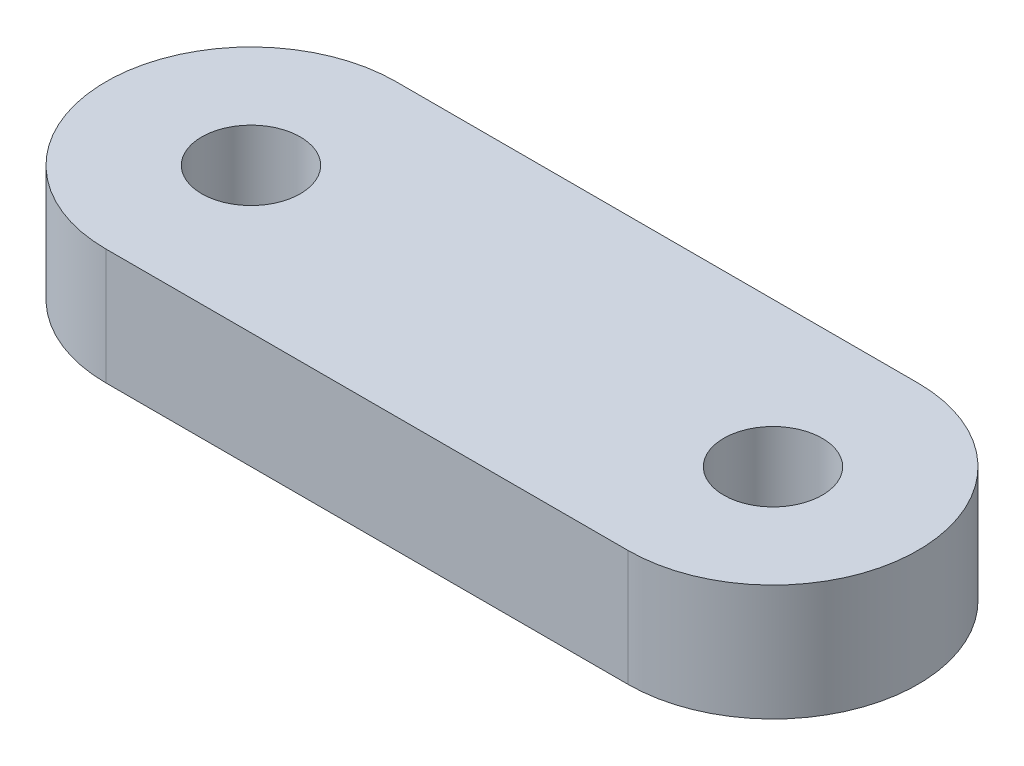
ISO-10303-21;
HEADER;
FILE_DESCRIPTION(('STEP AP214'),'2;1');
FILE_NAME('part.step','',(''),(''),'','','');
FILE_SCHEMA(('AUTOMOTIVE_DESIGN { 1 0 10303 214 1 1 1 1 }'));
ENDSEC;
DATA;
#1=APPLICATION_CONTEXT('core data for automotive mechanical design processes');
#2=APPLICATION_PROTOCOL_DEFINITION('international standard','automotive_design',2000,#1);
#3=PRODUCT_CONTEXT('',#1,'mechanical');
#4=PRODUCT('Part','Part','',(#3));
#5=PRODUCT_RELATED_PRODUCT_CATEGORY('part','',(#4));
#6=PRODUCT_DEFINITION_FORMATION('','',#4);
#7=PRODUCT_DEFINITION_CONTEXT('part definition',#1,'design');
#8=PRODUCT_DEFINITION('design','',#6,#7);
#9=PRODUCT_DEFINITION_SHAPE('','',#8);
#10=(LENGTH_UNIT() NAMED_UNIT(*) SI_UNIT(.MILLI.,.METRE.));
#11=(NAMED_UNIT(*) PLANE_ANGLE_UNIT() SI_UNIT($,.RADIAN.));
#12=(NAMED_UNIT(*) SI_UNIT($,.STERADIAN.) SOLID_ANGLE_UNIT());
#13=UNCERTAINTY_MEASURE_WITH_UNIT(LENGTH_MEASURE(1.E-05),#10,'distance_accuracy_value','');
#14=(GEOMETRIC_REPRESENTATION_CONTEXT(3) GLOBAL_UNCERTAINTY_ASSIGNED_CONTEXT((#13)) GLOBAL_UNIT_ASSIGNED_CONTEXT((#10,
#11,#12)) REPRESENTATION_CONTEXT('',''));
#15=CARTESIAN_POINT('',(0.,0.,0.));
#16=DIRECTION('',(0.,0.,1.));
#17=DIRECTION('',(1.,0.,0.));
#18=AXIS2_PLACEMENT_3D('',#15,#16,#17);
#19=CARTESIAN_POINT('',(9.,4.,0.));
#20=DIRECTION('',(0.,1.,0.));
#21=DIRECTION('',(0.,0.,1.));
#22=AXIS2_PLACEMENT_3D('',#19,#20,#21);
#23=PLANE('',#22);
#24=CARTESIAN_POINT('',(-9.,4.,0.));
#25=DIRECTION('',(0.,1.,0.));
#26=DIRECTION('',(0.,0.,1.));
#27=AXIS2_PLACEMENT_3D('',#24,#25,#26);
#28=CIRCLE('',#27,1.7);
#29=CARTESIAN_POINT('',(-9.,4.,1.7));
#30=VERTEX_POINT('',#29);
#31=EDGE_CURVE('E100',#30,#30,#28,.T.);
#32=ORIENTED_EDGE('',*,*,#31,.F.);
#33=EDGE_LOOP('',(#32));
#34=FACE_BOUND('',#33,.T.);
#35=CARTESIAN_POINT('',(9.,4.,0.));
#36=DIRECTION('',(0.,1.,0.));
#37=DIRECTION('',(0.,0.,1.));
#38=AXIS2_PLACEMENT_3D('',#35,#36,#37);
#39=CIRCLE('',#38,5.);
#40=CARTESIAN_POINT('',(9.,4.,5.));
#41=VERTEX_POINT('',#40);
#42=CARTESIAN_POINT('',(9.,4.,-5.));
#43=VERTEX_POINT('',#42);
#44=EDGE_CURVE('E85',#41,#43,#39,.T.);
#45=ORIENTED_EDGE('',*,*,#44,.T.);
#46=DIRECTION('',(-1.,0.,0.));
#47=VECTOR('',#46,1.);
#48=CARTESIAN_POINT('',(-9.,4.,-5.));
#49=LINE('',#48,#47);
#50=CARTESIAN_POINT('',(-9.,4.,-5.));
#51=VERTEX_POINT('',#50);
#52=EDGE_CURVE('E80',#43,#51,#49,.T.);
#53=ORIENTED_EDGE('',*,*,#52,.T.);
#54=CARTESIAN_POINT('',(-9.,4.,0.));
#55=DIRECTION('',(0.,1.,0.));
#56=DIRECTION('',(0.,0.,1.));
#57=AXIS2_PLACEMENT_3D('',#54,#55,#56);
#58=CIRCLE('',#57,5.);
#59=CARTESIAN_POINT('',(-9.,4.,5.));
#60=VERTEX_POINT('',#59);
#61=EDGE_CURVE('E83',#51,#60,#58,.T.);
#62=ORIENTED_EDGE('',*,*,#61,.T.);
#63=DIRECTION('',(1.,0.,0.));
#64=VECTOR('',#63,1.);
#65=CARTESIAN_POINT('',(-9.,4.,5.));
#66=LINE('',#65,#64);
#67=EDGE_CURVE('E50',#60,#41,#66,.T.);
#68=ORIENTED_EDGE('',*,*,#67,.T.);
#69=EDGE_LOOP('',(#45,#53,#62,#68));
#70=FACE_BOUND('',#69,.T.);
#71=CARTESIAN_POINT('',(9.,4.,0.));
#72=DIRECTION('',(0.,1.,0.));
#73=DIRECTION('',(0.,0.,1.));
#74=AXIS2_PLACEMENT_3D('',#71,#72,#73);
#75=CIRCLE('',#74,1.7);
#76=CARTESIAN_POINT('',(9.,4.,1.7));
#77=VERTEX_POINT('',#76);
#78=EDGE_CURVE('E115',#77,#77,#75,.T.);
#79=ORIENTED_EDGE('',*,*,#78,.F.);
#80=EDGE_LOOP('',(#79));
#81=FACE_BOUND('',#80,.T.);
#82=ADVANCED_FACE('F33',(#34,#70,#81),#23,.T.);
#83=CARTESIAN_POINT('',(9.,0.,0.));
#84=DIRECTION('',(0.,1.,0.));
#85=DIRECTION('',(0.,0.,1.));
#86=AXIS2_PLACEMENT_3D('',#83,#84,#85);
#87=PLANE('',#86);
#88=CARTESIAN_POINT('',(-9.,0.,0.));
#89=DIRECTION('',(0.,1.,0.));
#90=DIRECTION('',(0.,0.,1.));
#91=AXIS2_PLACEMENT_3D('',#88,#89,#90);
#92=CIRCLE('',#91,1.7);
#93=CARTESIAN_POINT('',(-9.,0.,1.7));
#94=VERTEX_POINT('',#93);
#95=EDGE_CURVE('E112',#94,#94,#92,.T.);
#96=ORIENTED_EDGE('',*,*,#95,.T.);
#97=EDGE_LOOP('',(#96));
#98=FACE_BOUND('',#97,.T.);
#99=CARTESIAN_POINT('',(9.,0.,0.));
#100=DIRECTION('',(0.,1.,0.));
#101=DIRECTION('',(0.,0.,1.));
#102=AXIS2_PLACEMENT_3D('',#99,#100,#101);
#103=CIRCLE('',#102,5.);
#104=CARTESIAN_POINT('',(9.,0.,5.));
#105=VERTEX_POINT('',#104);
#106=CARTESIAN_POINT('',(9.,0.,-5.));
#107=VERTEX_POINT('',#106);
#108=EDGE_CURVE('E97',#105,#107,#103,.T.);
#109=ORIENTED_EDGE('',*,*,#108,.F.);
#110=DIRECTION('',(1.,0.,0.));
#111=VECTOR('',#110,1.);
#112=CARTESIAN_POINT('',(-9.,0.,5.));
#113=LINE('',#112,#111);
#114=CARTESIAN_POINT('',(-9.,0.,5.));
#115=VERTEX_POINT('',#114);
#116=EDGE_CURVE('E73',#115,#105,#113,.T.);
#117=ORIENTED_EDGE('',*,*,#116,.F.);
#118=CARTESIAN_POINT('',(-9.,0.,0.));
#119=DIRECTION('',(0.,1.,0.));
#120=DIRECTION('',(0.,0.,1.));
#121=AXIS2_PLACEMENT_3D('',#118,#119,#120);
#122=CIRCLE('',#121,5.);
#123=CARTESIAN_POINT('',(-9.,0.,-5.));
#124=VERTEX_POINT('',#123);
#125=EDGE_CURVE('E67',#124,#115,#122,.T.);
#126=ORIENTED_EDGE('',*,*,#125,.F.);
#127=DIRECTION('',(-1.,0.,0.));
#128=VECTOR('',#127,1.);
#129=CARTESIAN_POINT('',(-9.,0.,-5.));
#130=LINE('',#129,#128);
#131=EDGE_CURVE('E89',#107,#124,#130,.T.);
#132=ORIENTED_EDGE('',*,*,#131,.F.);
#133=EDGE_LOOP('',(#109,#117,#126,#132));
#134=FACE_BOUND('',#133,.T.);
#135=CARTESIAN_POINT('',(9.,0.,0.));
#136=DIRECTION('',(0.,1.,0.));
#137=DIRECTION('',(0.,0.,1.));
#138=AXIS2_PLACEMENT_3D('',#135,#136,#137);
#139=CIRCLE('',#138,1.7);
#140=CARTESIAN_POINT('',(9.,0.,1.7));
#141=VERTEX_POINT('',#140);
#142=EDGE_CURVE('E118',#141,#141,#139,.T.);
#143=ORIENTED_EDGE('',*,*,#142,.T.);
#144=EDGE_LOOP('',(#143));
#145=FACE_BOUND('',#144,.T.);
#146=ADVANCED_FACE('F108',(#98,#134,#145),#87,.F.);
#147=CARTESIAN_POINT('',(9.,4.,0.));
#148=DIRECTION('',(0.,-1.,0.));
#149=DIRECTION('',(0.,0.,-1.));
#150=AXIS2_PLACEMENT_3D('',#147,#148,#149);
#151=CYLINDRICAL_SURFACE('',#150,5.);
#152=ORIENTED_EDGE('',*,*,#108,.T.);
#153=DIRECTION('',(0.,-1.,0.));
#154=VECTOR('',#153,1.);
#155=CARTESIAN_POINT('',(9.,4.,-5.));
#156=LINE('',#155,#154);
#157=EDGE_CURVE('E11',#43,#107,#156,.T.);
#158=ORIENTED_EDGE('',*,*,#157,.F.);
#159=ORIENTED_EDGE('',*,*,#44,.F.);
#160=DIRECTION('',(0.,-1.,0.));
#161=VECTOR('',#160,1.);
#162=CARTESIAN_POINT('',(9.,4.,5.));
#163=LINE('',#162,#161);
#164=EDGE_CURVE('E93',#41,#105,#163,.T.);
#165=ORIENTED_EDGE('',*,*,#164,.T.);
#166=EDGE_LOOP('',(#152,#158,#159,#165));
#167=FACE_BOUND('',#166,.T.);
#168=ADVANCED_FACE('F35',(#167),#151,.T.);
#169=CARTESIAN_POINT('',(-9.,4.,-5.));
#170=DIRECTION('',(0.,0.,1.));
#171=DIRECTION('',(1.,0.,0.));
#172=AXIS2_PLACEMENT_3D('',#169,#170,#171);
#173=PLANE('',#172);
#174=ORIENTED_EDGE('',*,*,#131,.T.);
#175=DIRECTION('',(0.,-1.,0.));
#176=VECTOR('',#175,1.);
#177=CARTESIAN_POINT('',(-9.,4.,-5.));
#178=LINE('',#177,#176);
#179=EDGE_CURVE('E42',#51,#124,#178,.T.);
#180=ORIENTED_EDGE('',*,*,#179,.F.);
#181=ORIENTED_EDGE('',*,*,#52,.F.);
#182=ORIENTED_EDGE('',*,*,#157,.T.);
#183=EDGE_LOOP('',(#174,#180,#181,#182));
#184=FACE_BOUND('',#183,.T.);
#185=ADVANCED_FACE('F88',(#184),#173,.F.);
#186=CARTESIAN_POINT('',(-9.,4.,0.));
#187=DIRECTION('',(0.,-1.,0.));
#188=DIRECTION('',(0.,0.,-1.));
#189=AXIS2_PLACEMENT_3D('',#186,#187,#188);
#190=CYLINDRICAL_SURFACE('',#189,5.);
#191=ORIENTED_EDGE('',*,*,#125,.T.);
#192=DIRECTION('',(0.,-1.,0.));
#193=VECTOR('',#192,1.);
#194=CARTESIAN_POINT('',(-9.,4.,5.));
#195=LINE('',#194,#193);
#196=EDGE_CURVE('E90',#60,#115,#195,.T.);
#197=ORIENTED_EDGE('',*,*,#196,.F.);
#198=ORIENTED_EDGE('',*,*,#61,.F.);
#199=ORIENTED_EDGE('',*,*,#179,.T.);
#200=EDGE_LOOP('',(#191,#197,#198,#199));
#201=FACE_BOUND('',#200,.T.);
#202=ADVANCED_FACE('F91',(#201),#190,.T.);
#203=CARTESIAN_POINT('',(-9.,4.,5.));
#204=DIRECTION('',(0.,0.,-1.));
#205=DIRECTION('',(-1.,0.,0.));
#206=AXIS2_PLACEMENT_3D('',#203,#204,#205);
#207=PLANE('',#206);
#208=ORIENTED_EDGE('',*,*,#116,.T.);
#209=ORIENTED_EDGE('',*,*,#164,.F.);
#210=ORIENTED_EDGE('',*,*,#67,.F.);
#211=ORIENTED_EDGE('',*,*,#196,.T.);
#212=EDGE_LOOP('',(#208,#209,#210,#211));
#213=FACE_BOUND('',#212,.T.);
#214=ADVANCED_FACE('F105',(#213),#207,.F.);
#215=CARTESIAN_POINT('',(-9.,4.,0.));
#216=DIRECTION('',(0.,-1.,0.));
#217=DIRECTION('',(0.,0.,-1.));
#218=AXIS2_PLACEMENT_3D('',#215,#216,#217);
#219=CYLINDRICAL_SURFACE('',#218,1.7);
#220=ORIENTED_EDGE('',*,*,#31,.T.);
#221=EDGE_LOOP('',(#220));
#222=FACE_BOUND('',#221,.T.);
#223=ORIENTED_EDGE('',*,*,#95,.F.);
#224=EDGE_LOOP('',(#223));
#225=FACE_BOUND('',#224,.T.);
#226=ADVANCED_FACE('F136',(#222,#225),#219,.F.);
#227=CARTESIAN_POINT('',(9.,4.,0.));
#228=DIRECTION('',(0.,-1.,0.));
#229=DIRECTION('',(0.,0.,-1.));
#230=AXIS2_PLACEMENT_3D('',#227,#228,#229);
#231=CYLINDRICAL_SURFACE('',#230,1.7);
#232=ORIENTED_EDGE('',*,*,#78,.T.);
#233=EDGE_LOOP('',(#232));
#234=FACE_BOUND('',#233,.T.);
#235=ORIENTED_EDGE('',*,*,#142,.F.);
#236=EDGE_LOOP('',(#235));
#237=FACE_BOUND('',#236,.T.);
#238=ADVANCED_FACE('F124',(#234,#237),#231,.F.);
#239=CLOSED_SHELL('',(#82,#146,#168,#185,#202,#214,#226,#238));
#240=MANIFOLD_SOLID_BREP('B2',#239);
#241=ADVANCED_BREP_SHAPE_REPRESENTATION('',(#18,#240),#14);
#242=SHAPE_DEFINITION_REPRESENTATION(#9,#241);
ENDSEC;
END-ISO-10303-21;
